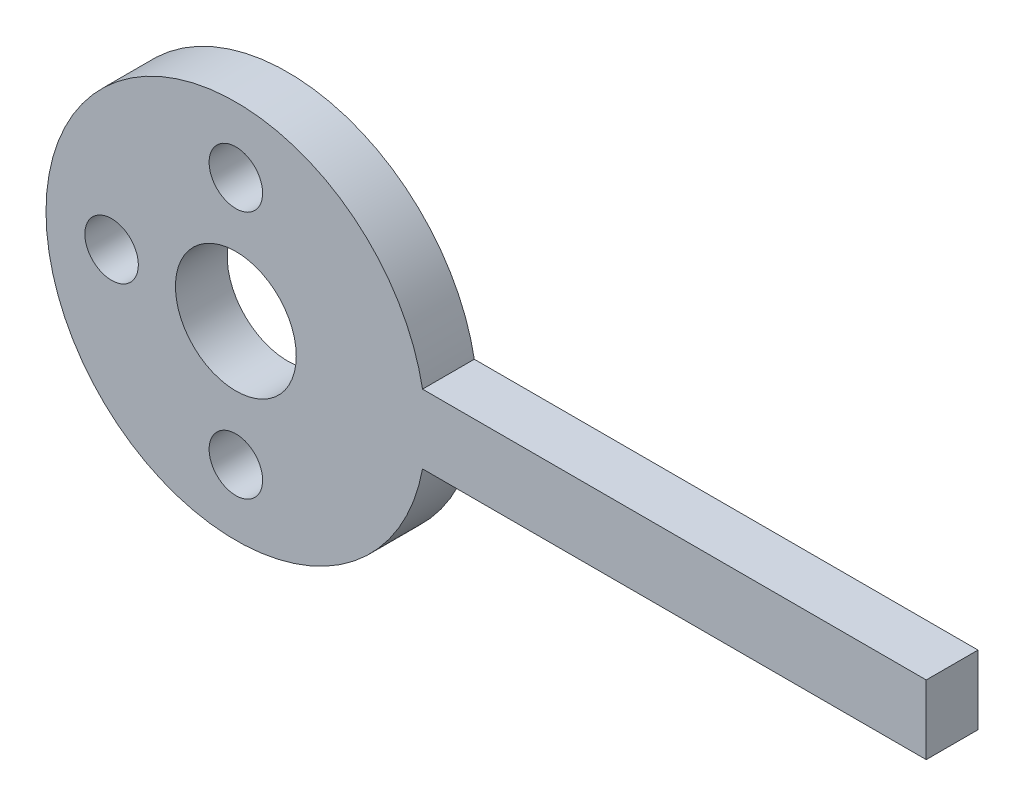
ISO-10303-21;
HEADER;
FILE_DESCRIPTION(('STEP AP214'),'2;1');
FILE_NAME('part.step','',(''),(''),'','','');
FILE_SCHEMA(('AUTOMOTIVE_DESIGN { 1 0 10303 214 1 1 1 1 }'));
ENDSEC;
DATA;
#1=APPLICATION_CONTEXT('core data for automotive mechanical design processes');
#2=APPLICATION_PROTOCOL_DEFINITION('international standard','automotive_design',2000,#1);
#3=PRODUCT_CONTEXT('',#1,'mechanical');
#4=PRODUCT('Part','Part','',(#3));
#5=PRODUCT_RELATED_PRODUCT_CATEGORY('part','',(#4));
#6=PRODUCT_DEFINITION_FORMATION('','',#4);
#7=PRODUCT_DEFINITION_CONTEXT('part definition',#1,'design');
#8=PRODUCT_DEFINITION('design','',#6,#7);
#9=PRODUCT_DEFINITION_SHAPE('','',#8);
#10=(LENGTH_UNIT() NAMED_UNIT(*) SI_UNIT(.MILLI.,.METRE.));
#11=(NAMED_UNIT(*) PLANE_ANGLE_UNIT() SI_UNIT($,.RADIAN.));
#12=(NAMED_UNIT(*) SI_UNIT($,.STERADIAN.) SOLID_ANGLE_UNIT());
#13=UNCERTAINTY_MEASURE_WITH_UNIT(LENGTH_MEASURE(1.E-05),#10,'distance_accuracy_value','');
#14=(GEOMETRIC_REPRESENTATION_CONTEXT(3) GLOBAL_UNCERTAINTY_ASSIGNED_CONTEXT((#13)) GLOBAL_UNIT_ASSIGNED_CONTEXT((#10,
#11,#12)) REPRESENTATION_CONTEXT('',''));
#15=CARTESIAN_POINT('',(0.,0.,0.));
#16=DIRECTION('',(0.,0.,1.));
#17=DIRECTION('',(1.,0.,0.));
#18=AXIS2_PLACEMENT_3D('',#15,#16,#17);
#19=CARTESIAN_POINT('',(0.,0.,3.));
#20=DIRECTION('',(0.,0.,-1.));
#21=DIRECTION('',(-1.,0.,0.));
#22=AXIS2_PLACEMENT_3D('',#19,#20,#21);
#23=CYLINDRICAL_SURFACE('',#22,11.);
#24=CARTESIAN_POINT('',(0.,0.,0.));
#25=DIRECTION('',(0.,0.,1.));
#26=DIRECTION('',(1.,0.,0.));
#27=AXIS2_PLACEMENT_3D('',#24,#25,#26);
#28=CIRCLE('',#27,11.);
#29=CARTESIAN_POINT('',(10.816653826392,2.,0.));
#30=VERTEX_POINT('',#29);
#31=CARTESIAN_POINT('',(10.816653826392,-2.,0.));
#32=VERTEX_POINT('',#31);
#33=EDGE_CURVE('E111',#30,#32,#28,.T.);
#34=ORIENTED_EDGE('',*,*,#33,.T.);
#35=DIRECTION('',(0.,0.,-1.));
#36=VECTOR('',#35,1.);
#37=CARTESIAN_POINT('',(10.816653826392,-2.,3.));
#38=LINE('',#37,#36);
#39=CARTESIAN_POINT('',(10.816653826392,-2.,3.));
#40=VERTEX_POINT('',#39);
#41=EDGE_CURVE('E11',#40,#32,#38,.T.);
#42=ORIENTED_EDGE('',*,*,#41,.F.);
#43=CARTESIAN_POINT('',(0.,0.,3.));
#44=DIRECTION('',(0.,0.,1.));
#45=DIRECTION('',(1.,0.,0.));
#46=AXIS2_PLACEMENT_3D('',#43,#44,#45);
#47=CIRCLE('',#46,11.);
#48=CARTESIAN_POINT('',(10.816653826392,2.,3.));
#49=VERTEX_POINT('',#48);
#50=EDGE_CURVE('E75',#49,#40,#47,.T.);
#51=ORIENTED_EDGE('',*,*,#50,.F.);
#52=DIRECTION('',(0.,0.,-1.));
#53=VECTOR('',#52,1.);
#54=CARTESIAN_POINT('',(10.816653826392,2.,3.));
#55=LINE('',#54,#53);
#56=EDGE_CURVE('E107',#49,#30,#55,.T.);
#57=ORIENTED_EDGE('',*,*,#56,.T.);
#58=EDGE_LOOP('',(#34,#42,#51,#57));
#59=FACE_BOUND('',#58,.T.);
#60=ADVANCED_FACE('F35',(#59),#23,.T.);
#61=CARTESIAN_POINT('',(0.,-2.,3.));
#62=DIRECTION('',(0.,-1.,0.));
#63=DIRECTION('',(0.,0.,-1.));
#64=AXIS2_PLACEMENT_3D('',#61,#62,#63);
#65=PLANE('',#64);
#66=DIRECTION('',(-1.,0.,0.));
#67=VECTOR('',#66,1.);
#68=CARTESIAN_POINT('',(0.,-2.,0.));
#69=LINE('',#68,#67);
#70=CARTESIAN_POINT('',(40.,-2.,0.));
#71=VERTEX_POINT('',#70);
#72=EDGE_CURVE('E84',#71,#32,#69,.T.);
#73=ORIENTED_EDGE('',*,*,#72,.F.);
#74=DIRECTION('',(0.,0.,-1.));
#75=VECTOR('',#74,1.);
#76=CARTESIAN_POINT('',(40.,-2.,3.));
#77=LINE('',#76,#75);
#78=CARTESIAN_POINT('',(40.,-2.,3.));
#79=VERTEX_POINT('',#78);
#80=EDGE_CURVE('E44',#79,#71,#77,.T.);
#81=ORIENTED_EDGE('',*,*,#80,.F.);
#82=DIRECTION('',(-1.,0.,0.));
#83=VECTOR('',#82,1.);
#84=CARTESIAN_POINT('',(0.,-2.,3.));
#85=LINE('',#84,#83);
#86=EDGE_CURVE('E82',#79,#40,#85,.T.);
#87=ORIENTED_EDGE('',*,*,#86,.T.);
#88=ORIENTED_EDGE('',*,*,#41,.T.);
#89=EDGE_LOOP('',(#73,#81,#87,#88));
#90=FACE_BOUND('',#89,.T.);
#91=ADVANCED_FACE('F81',(#90),#65,.T.);
#92=CARTESIAN_POINT('',(40.,0.,3.));
#93=DIRECTION('',(1.,0.,0.));
#94=DIRECTION('',(0.,0.,-1.));
#95=AXIS2_PLACEMENT_3D('',#92,#93,#94);
#96=PLANE('',#95);
#97=DIRECTION('',(0.,-1.,0.));
#98=VECTOR('',#97,1.);
#99=CARTESIAN_POINT('',(40.,0.,0.));
#100=LINE('',#99,#98);
#101=CARTESIAN_POINT('',(40.,2.,0.));
#102=VERTEX_POINT('',#101);
#103=EDGE_CURVE('E115',#102,#71,#100,.T.);
#104=ORIENTED_EDGE('',*,*,#103,.F.);
#105=DIRECTION('',(0.,0.,-1.));
#106=VECTOR('',#105,1.);
#107=CARTESIAN_POINT('',(40.,2.,3.));
#108=LINE('',#107,#106);
#109=CARTESIAN_POINT('',(40.,2.,3.));
#110=VERTEX_POINT('',#109);
#111=EDGE_CURVE('E67',#110,#102,#108,.T.);
#112=ORIENTED_EDGE('',*,*,#111,.F.);
#113=DIRECTION('',(0.,-1.,0.));
#114=VECTOR('',#113,1.);
#115=CARTESIAN_POINT('',(40.,0.,3.));
#116=LINE('',#115,#114);
#117=EDGE_CURVE('E91',#110,#79,#116,.T.);
#118=ORIENTED_EDGE('',*,*,#117,.T.);
#119=ORIENTED_EDGE('',*,*,#80,.T.);
#120=EDGE_LOOP('',(#104,#112,#118,#119));
#121=FACE_BOUND('',#120,.T.);
#122=ADVANCED_FACE('F93',(#121),#96,.T.);
#123=CARTESIAN_POINT('',(-7.19999999082808,0.,3.));
#124=DIRECTION('',(0.,0.,-1.));
#125=DIRECTION('',(-1.,0.,0.));
#126=AXIS2_PLACEMENT_3D('',#123,#124,#125);
#127=CYLINDRICAL_SURFACE('',#126,1.55);
#128=CARTESIAN_POINT('',(-7.19999999082808,0.,3.));
#129=DIRECTION('',(0.,0.,1.));
#130=DIRECTION('',(1.,0.,0.));
#131=AXIS2_PLACEMENT_3D('',#128,#129,#130);
#132=CIRCLE('',#131,1.55);
#133=CARTESIAN_POINT('',(-5.64999999082808,0.,3.));
#134=VERTEX_POINT('',#133);
#135=EDGE_CURVE('E101',#134,#134,#132,.T.);
#136=ORIENTED_EDGE('',*,*,#135,.T.);
#137=EDGE_LOOP('',(#136));
#138=FACE_BOUND('',#137,.T.);
#139=CARTESIAN_POINT('',(-7.19999999082808,0.,0.));
#140=DIRECTION('',(0.,0.,1.));
#141=DIRECTION('',(1.,0.,0.));
#142=AXIS2_PLACEMENT_3D('',#139,#140,#141);
#143=CIRCLE('',#142,1.55);
#144=CARTESIAN_POINT('',(-5.64999999082808,0.,0.));
#145=VERTEX_POINT('',#144);
#146=EDGE_CURVE('E121',#145,#145,#143,.T.);
#147=ORIENTED_EDGE('',*,*,#146,.F.);
#148=EDGE_LOOP('',(#147));
#149=FACE_BOUND('',#148,.T.);
#150=ADVANCED_FACE('F164',(#138,#149),#127,.F.);
#151=CARTESIAN_POINT('',(0.,-7.19999998681005,3.));
#152=DIRECTION('',(0.,0.,-1.));
#153=DIRECTION('',(-1.,0.,0.));
#154=AXIS2_PLACEMENT_3D('',#151,#152,#153);
#155=CYLINDRICAL_SURFACE('',#154,1.55);
#156=CARTESIAN_POINT('',(0.,-7.19999998681005,3.));
#157=DIRECTION('',(0.,0.,1.));
#158=DIRECTION('',(1.,0.,0.));
#159=AXIS2_PLACEMENT_3D('',#156,#157,#158);
#160=CIRCLE('',#159,1.55);
#161=CARTESIAN_POINT('',(1.55000000000003,-7.19999998681005,3.));
#162=VERTEX_POINT('',#161);
#163=EDGE_CURVE('E95',#162,#162,#160,.T.);
#164=ORIENTED_EDGE('',*,*,#163,.T.);
#165=EDGE_LOOP('',(#164));
#166=FACE_BOUND('',#165,.T.);
#167=CARTESIAN_POINT('',(0.,-7.19999998681005,0.));
#168=DIRECTION('',(0.,0.,1.));
#169=DIRECTION('',(1.,0.,0.));
#170=AXIS2_PLACEMENT_3D('',#167,#168,#169);
#171=CIRCLE('',#170,1.55);
#172=CARTESIAN_POINT('',(1.55000000000003,-7.19999998681005,0.));
#173=VERTEX_POINT('',#172);
#174=EDGE_CURVE('E118',#173,#173,#171,.T.);
#175=ORIENTED_EDGE('',*,*,#174,.F.);
#176=EDGE_LOOP('',(#175));
#177=FACE_BOUND('',#176,.T.);
#178=ADVANCED_FACE('F167',(#166,#177),#155,.F.);
#179=CARTESIAN_POINT('',(0.,2.,3.));
#180=DIRECTION('',(0.,-1.,0.));
#181=DIRECTION('',(0.,0.,-1.));
#182=AXIS2_PLACEMENT_3D('',#179,#180,#181);
#183=PLANE('',#182);
#184=DIRECTION('',(-1.,0.,0.));
#185=VECTOR('',#184,1.);
#186=CARTESIAN_POINT('',(0.,2.,0.));
#187=LINE('',#186,#185);
#188=EDGE_CURVE('E70',#102,#30,#187,.T.);
#189=ORIENTED_EDGE('',*,*,#188,.T.);
#190=ORIENTED_EDGE('',*,*,#56,.F.);
#191=DIRECTION('',(-1.,0.,0.));
#192=VECTOR('',#191,1.);
#193=CARTESIAN_POINT('',(0.,2.,3.));
#194=LINE('',#193,#192);
#195=EDGE_CURVE('E52',#110,#49,#194,.T.);
#196=ORIENTED_EDGE('',*,*,#195,.F.);
#197=ORIENTED_EDGE('',*,*,#111,.T.);
#198=EDGE_LOOP('',(#189,#190,#196,#197));
#199=FACE_BOUND('',#198,.T.);
#200=ADVANCED_FACE('F153',(#199),#183,.F.);
#201=CARTESIAN_POINT('',(0.,0.,3.));
#202=DIRECTION('',(0.,0.,-1.));
#203=DIRECTION('',(-1.,0.,0.));
#204=AXIS2_PLACEMENT_3D('',#201,#202,#203);
#205=CYLINDRICAL_SURFACE('',#204,3.50000000000003);
#206=CARTESIAN_POINT('',(0.,0.,3.));
#207=DIRECTION('',(0.,0.,1.));
#208=DIRECTION('',(1.,0.,0.));
#209=AXIS2_PLACEMENT_3D('',#206,#207,#208);
#210=CIRCLE('',#209,3.50000000000003);
#211=CARTESIAN_POINT('',(3.50000000000003,0.,3.));
#212=VERTEX_POINT('',#211);
#213=EDGE_CURVE('E127',#212,#212,#210,.T.);
#214=ORIENTED_EDGE('',*,*,#213,.T.);
#215=EDGE_LOOP('',(#214));
#216=FACE_BOUND('',#215,.T.);
#217=CARTESIAN_POINT('',(0.,0.,0.));
#218=DIRECTION('',(0.,0.,1.));
#219=DIRECTION('',(1.,0.,0.));
#220=AXIS2_PLACEMENT_3D('',#217,#218,#219);
#221=CIRCLE('',#220,3.50000000000003);
#222=CARTESIAN_POINT('',(3.50000000000003,0.,0.));
#223=VERTEX_POINT('',#222);
#224=EDGE_CURVE('E108',#223,#223,#221,.T.);
#225=ORIENTED_EDGE('',*,*,#224,.F.);
#226=EDGE_LOOP('',(#225));
#227=FACE_BOUND('',#226,.T.);
#228=ADVANCED_FACE('F37',(#216,#227),#205,.F.);
#229=CARTESIAN_POINT('',(0.,7.19999999427738,3.));
#230=DIRECTION('',(0.,0.,-1.));
#231=DIRECTION('',(-1.,0.,0.));
#232=AXIS2_PLACEMENT_3D('',#229,#230,#231);
#233=CYLINDRICAL_SURFACE('',#232,1.55);
#234=CARTESIAN_POINT('',(0.,7.19999999427738,3.));
#235=DIRECTION('',(0.,0.,1.));
#236=DIRECTION('',(1.,0.,0.));
#237=AXIS2_PLACEMENT_3D('',#234,#235,#236);
#238=CIRCLE('',#237,1.55);
#239=CARTESIAN_POINT('',(1.54999999999996,7.19999999427738,3.));
#240=VERTEX_POINT('',#239);
#241=EDGE_CURVE('E104',#240,#240,#238,.T.);
#242=ORIENTED_EDGE('',*,*,#241,.T.);
#243=EDGE_LOOP('',(#242));
#244=FACE_BOUND('',#243,.T.);
#245=CARTESIAN_POINT('',(0.,7.19999999427738,0.));
#246=DIRECTION('',(0.,0.,1.));
#247=DIRECTION('',(1.,0.,0.));
#248=AXIS2_PLACEMENT_3D('',#245,#246,#247);
#249=CIRCLE('',#248,1.55);
#250=CARTESIAN_POINT('',(1.54999999999996,7.19999999427738,0.));
#251=VERTEX_POINT('',#250);
#252=EDGE_CURVE('E124',#251,#251,#249,.T.);
#253=ORIENTED_EDGE('',*,*,#252,.F.);
#254=EDGE_LOOP('',(#253));
#255=FACE_BOUND('',#254,.T.);
#256=ADVANCED_FACE('F143',(#244,#255),#233,.F.);
#257=CARTESIAN_POINT('',(0.,0.,3.));
#258=DIRECTION('',(0.,0.,1.));
#259=DIRECTION('',(1.,0.,0.));
#260=AXIS2_PLACEMENT_3D('',#257,#258,#259);
#261=PLANE('',#260);
#262=ORIENTED_EDGE('',*,*,#213,.F.);
#263=EDGE_LOOP('',(#262));
#264=FACE_BOUND('',#263,.T.);
#265=ORIENTED_EDGE('',*,*,#50,.T.);
#266=ORIENTED_EDGE('',*,*,#86,.F.);
#267=ORIENTED_EDGE('',*,*,#117,.F.);
#268=ORIENTED_EDGE('',*,*,#195,.T.);
#269=EDGE_LOOP('',(#265,#266,#267,#268));
#270=FACE_BOUND('',#269,.T.);
#271=ORIENTED_EDGE('',*,*,#163,.F.);
#272=EDGE_LOOP('',(#271));
#273=FACE_BOUND('',#272,.T.);
#274=ORIENTED_EDGE('',*,*,#135,.F.);
#275=EDGE_LOOP('',(#274));
#276=FACE_BOUND('',#275,.T.);
#277=ORIENTED_EDGE('',*,*,#241,.F.);
#278=EDGE_LOOP('',(#277));
#279=FACE_BOUND('',#278,.T.);
#280=ADVANCED_FACE('F89',(#264,#270,#273,#276,#279),#261,.T.);
#281=CARTESIAN_POINT('',(0.,0.,0.));
#282=DIRECTION('',(0.,0.,1.));
#283=DIRECTION('',(1.,0.,0.));
#284=AXIS2_PLACEMENT_3D('',#281,#282,#283);
#285=PLANE('',#284);
#286=ORIENTED_EDGE('',*,*,#224,.T.);
#287=EDGE_LOOP('',(#286));
#288=FACE_BOUND('',#287,.T.);
#289=ORIENTED_EDGE('',*,*,#33,.F.);
#290=ORIENTED_EDGE('',*,*,#188,.F.);
#291=ORIENTED_EDGE('',*,*,#103,.T.);
#292=ORIENTED_EDGE('',*,*,#72,.T.);
#293=EDGE_LOOP('',(#289,#290,#291,#292));
#294=FACE_BOUND('',#293,.T.);
#295=ORIENTED_EDGE('',*,*,#174,.T.);
#296=EDGE_LOOP('',(#295));
#297=FACE_BOUND('',#296,.T.);
#298=ORIENTED_EDGE('',*,*,#146,.T.);
#299=EDGE_LOOP('',(#298));
#300=FACE_BOUND('',#299,.T.);
#301=ORIENTED_EDGE('',*,*,#252,.T.);
#302=EDGE_LOOP('',(#301));
#303=FACE_BOUND('',#302,.T.);
#304=ADVANCED_FACE('F132',(#288,#294,#297,#300,#303),#285,.F.);
#305=CLOSED_SHELL('',(#60,#91,#122,#150,#178,#200,#228,#256,#280,#304));
#306=MANIFOLD_SOLID_BREP('B2',#305);
#307=ADVANCED_BREP_SHAPE_REPRESENTATION('',(#18,#306),#14);
#308=SHAPE_DEFINITION_REPRESENTATION(#9,#307);
ENDSEC;
END-ISO-10303-21;
